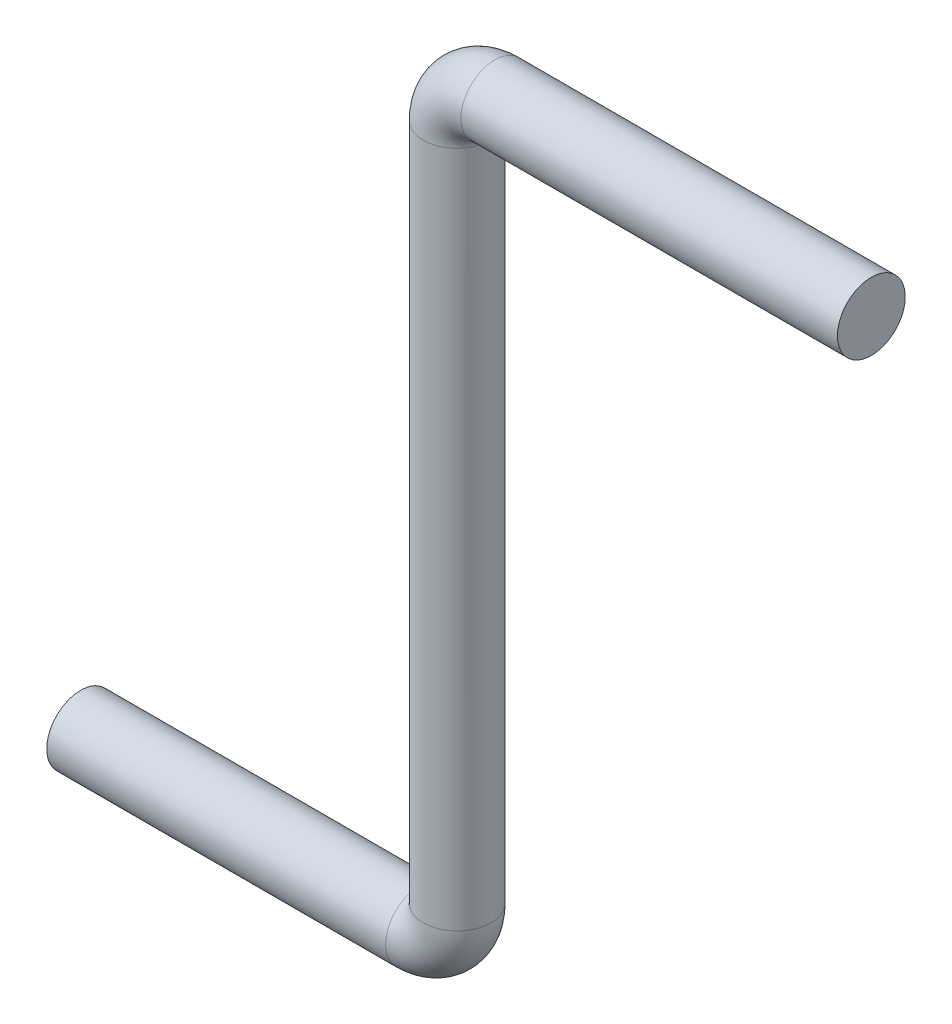
ISO-10303-21;
HEADER;
FILE_DESCRIPTION(('STEP AP214'),'2;1');
FILE_NAME('part.step','',(''),(''),'','','');
FILE_SCHEMA(('AUTOMOTIVE_DESIGN { 1 0 10303 214 1 1 1 1 }'));
ENDSEC;
DATA;
#1=APPLICATION_CONTEXT('core data for automotive mechanical design processes');
#2=APPLICATION_PROTOCOL_DEFINITION('international standard','automotive_design',2000,#1);
#3=PRODUCT_CONTEXT('',#1,'mechanical');
#4=PRODUCT('Part','Part','',(#3));
#5=PRODUCT_RELATED_PRODUCT_CATEGORY('part','',(#4));
#6=PRODUCT_DEFINITION_FORMATION('','',#4);
#7=PRODUCT_DEFINITION_CONTEXT('part definition',#1,'design');
#8=PRODUCT_DEFINITION('design','',#6,#7);
#9=PRODUCT_DEFINITION_SHAPE('','',#8);
#10=(LENGTH_UNIT() NAMED_UNIT(*) SI_UNIT(.MILLI.,.METRE.));
#11=(NAMED_UNIT(*) PLANE_ANGLE_UNIT() SI_UNIT($,.RADIAN.));
#12=(NAMED_UNIT(*) SI_UNIT($,.STERADIAN.) SOLID_ANGLE_UNIT());
#13=UNCERTAINTY_MEASURE_WITH_UNIT(LENGTH_MEASURE(1.E-05),#10,'distance_accuracy_value','');
#14=(GEOMETRIC_REPRESENTATION_CONTEXT(3) GLOBAL_UNCERTAINTY_ASSIGNED_CONTEXT((#13)) GLOBAL_UNIT_ASSIGNED_CONTEXT((#10,
#11,#12)) REPRESENTATION_CONTEXT('',''));
#15=CARTESIAN_POINT('',(0.,0.,0.));
#16=DIRECTION('',(0.,0.,1.));
#17=DIRECTION('',(1.,0.,0.));
#18=AXIS2_PLACEMENT_3D('',#15,#16,#17);
#19=CARTESIAN_POINT('',(-5.,-5.,0.));
#20=DIRECTION('',(-1.,0.,0.));
#21=DIRECTION('',(0.,-1.,0.));
#22=AXIS2_PLACEMENT_3D('',#19,#20,#21);
#23=PLANE('',#22);
#24=CARTESIAN_POINT('',(-5.,-5.,0.));
#25=DIRECTION('',(-1.,0.,0.));
#26=DIRECTION('',(0.,-1.,0.));
#27=AXIS2_PLACEMENT_3D('',#24,#25,#26);
#28=CIRCLE('',#27,0.45);
#29=CARTESIAN_POINT('',(-5.,-5.45,0.));
#30=VERTEX_POINT('',#29);
#31=EDGE_CURVE('E68',#30,#30,#28,.T.);
#32=ORIENTED_EDGE('',*,*,#31,.T.);
#33=EDGE_LOOP('',(#32));
#34=FACE_BOUND('',#33,.T.);
#35=ADVANCED_FACE('F46',(#34),#23,.T.);
#36=CARTESIAN_POINT('',(5.5,5.,0.));
#37=DIRECTION('',(-1.,0.,0.));
#38=DIRECTION('',(0.,-1.,0.));
#39=AXIS2_PLACEMENT_3D('',#36,#37,#38);
#40=PLANE('',#39);
#41=CARTESIAN_POINT('',(5.5,5.,0.));
#42=DIRECTION('',(-1.,0.,0.));
#43=DIRECTION('',(0.,-1.,0.));
#44=AXIS2_PLACEMENT_3D('',#41,#42,#43);
#45=CIRCLE('',#44,0.45);
#46=CARTESIAN_POINT('',(5.5,4.55,0.));
#47=VERTEX_POINT('',#46);
#48=EDGE_CURVE('E11',#47,#47,#45,.T.);
#49=ORIENTED_EDGE('',*,*,#48,.F.);
#50=EDGE_LOOP('',(#49));
#51=FACE_BOUND('',#50,.T.);
#52=ADVANCED_FACE('F76',(#51),#40,.F.);
#53=CARTESIAN_POINT('',(-5.,-5.,0.));
#54=DIRECTION('',(1.,0.,0.));
#55=DIRECTION('',(0.,0.,-1.));
#56=AXIS2_PLACEMENT_3D('',#53,#54,#55);
#57=CYLINDRICAL_SURFACE('',#56,0.45);
#58=CARTESIAN_POINT('',(-0.5,-5.,0.));
#59=DIRECTION('',(-1.,0.,0.));
#60=DIRECTION('',(0.,-1.,0.));
#61=AXIS2_PLACEMENT_3D('',#58,#59,#60);
#62=CIRCLE('',#61,0.45);
#63=CARTESIAN_POINT('',(-0.500000000000002,-5.45,0.));
#64=VERTEX_POINT('',#63);
#65=EDGE_CURVE('E65',#64,#64,#62,.T.);
#66=ORIENTED_EDGE('',*,*,#65,.T.);
#67=EDGE_LOOP('',(#66));
#68=FACE_BOUND('',#67,.T.);
#69=ORIENTED_EDGE('',*,*,#31,.F.);
#70=EDGE_LOOP('',(#69));
#71=FACE_BOUND('',#70,.T.);
#72=ADVANCED_FACE('F73',(#68,#71),#57,.T.);
#73=CARTESIAN_POINT('',(-0.499999999999999,-4.5,0.));
#74=DIRECTION('',(0.,0.,1.));
#75=DIRECTION('',(1.,0.,0.));
#76=AXIS2_PLACEMENT_3D('',#73,#74,#75);
#77=TOROIDAL_SURFACE('',#76,0.499999999999996,0.45);
#78=CARTESIAN_POINT('',(0.,-4.5,0.));
#79=DIRECTION('',(0.,-1.,0.));
#80=DIRECTION('',(1.,0.,0.));
#81=AXIS2_PLACEMENT_3D('',#78,#79,#80);
#82=CIRCLE('',#81,0.45);
#83=CARTESIAN_POINT('',(0.449999999999998,-4.5,0.));
#84=VERTEX_POINT('',#83);
#85=EDGE_CURVE('E60',#84,#84,#82,.T.);
#86=CARTESIAN_POINT('',(-0.499999999999999,-4.5,0.));
#87=DIRECTION('',(0.,0.,1.));
#88=DIRECTION('',(1.,0.,0.));
#89=AXIS2_PLACEMENT_3D('',#86,#87,#88);
#90=CIRCLE('',#89,0.949999999999996);
#91=EDGE_CURVE('',#64,#84,#90,.T.);
#92=ORIENTED_EDGE('',*,*,#65,.F.);
#93=ORIENTED_EDGE('',*,*,#85,.T.);
#94=ORIENTED_EDGE('',*,*,#91,.T.);
#95=ORIENTED_EDGE('',*,*,#91,.F.);
#96=EDGE_LOOP('',(#92,#94,#93,#95));
#97=FACE_BOUND('',#96,.T.);
#98=ADVANCED_FACE('F75',(#97),#77,.T.);
#99=CARTESIAN_POINT('',(0.,-4.5,0.));
#100=DIRECTION('',(0.,1.,0.));
#101=DIRECTION('',(-1.,0.,0.));
#102=AXIS2_PLACEMENT_3D('',#99,#100,#101);
#103=CYLINDRICAL_SURFACE('',#102,0.45);
#104=CARTESIAN_POINT('',(0.,4.5,0.));
#105=DIRECTION('',(0.,-1.,0.));
#106=DIRECTION('',(1.,0.,0.));
#107=AXIS2_PLACEMENT_3D('',#104,#105,#106);
#108=CIRCLE('',#107,0.45);
#109=CARTESIAN_POINT('',(-0.45,4.5,0.));
#110=VERTEX_POINT('',#109);
#111=EDGE_CURVE('E56',#110,#110,#108,.T.);
#112=ORIENTED_EDGE('',*,*,#111,.T.);
#113=EDGE_LOOP('',(#112));
#114=FACE_BOUND('',#113,.T.);
#115=ORIENTED_EDGE('',*,*,#85,.F.);
#116=EDGE_LOOP('',(#115));
#117=FACE_BOUND('',#116,.T.);
#118=ADVANCED_FACE('F83',(#114,#117),#103,.T.);
#119=CARTESIAN_POINT('',(0.499999999999999,4.5,0.));
#120=DIRECTION('',(0.,0.,-1.));
#121=DIRECTION('',(-1.,0.,0.));
#122=AXIS2_PLACEMENT_3D('',#119,#120,#121);
#123=TOROIDAL_SURFACE('',#122,0.499999999999999,0.45);
#124=CARTESIAN_POINT('',(0.499999999999997,5.,0.));
#125=DIRECTION('',(-1.,0.,0.));
#126=DIRECTION('',(0.,-1.,0.));
#127=AXIS2_PLACEMENT_3D('',#124,#125,#126);
#128=CIRCLE('',#127,0.45);
#129=CARTESIAN_POINT('',(0.499999999999996,5.45,0.));
#130=VERTEX_POINT('',#129);
#131=EDGE_CURVE('E52',#130,#130,#128,.T.);
#132=CARTESIAN_POINT('',(0.499999999999999,4.5,0.));
#133=DIRECTION('',(0.,0.,-1.));
#134=DIRECTION('',(-1.,0.,0.));
#135=AXIS2_PLACEMENT_3D('',#132,#133,#134);
#136=CIRCLE('',#135,0.949999999999999);
#137=EDGE_CURVE('',#110,#130,#136,.T.);
#138=ORIENTED_EDGE('',*,*,#111,.F.);
#139=ORIENTED_EDGE('',*,*,#131,.T.);
#140=ORIENTED_EDGE('',*,*,#137,.T.);
#141=ORIENTED_EDGE('',*,*,#137,.F.);
#142=EDGE_LOOP('',(#138,#140,#139,#141));
#143=FACE_BOUND('',#142,.T.);
#144=ADVANCED_FACE('F89',(#143),#123,.T.);
#145=CARTESIAN_POINT('',(0.499999999999999,5.,0.));
#146=DIRECTION('',(1.,0.,0.));
#147=DIRECTION('',(0.,1.,0.));
#148=AXIS2_PLACEMENT_3D('',#145,#146,#147);
#149=CYLINDRICAL_SURFACE('',#148,0.45);
#150=ORIENTED_EDGE('',*,*,#48,.T.);
#151=EDGE_LOOP('',(#150));
#152=FACE_BOUND('',#151,.T.);
#153=ORIENTED_EDGE('',*,*,#131,.F.);
#154=EDGE_LOOP('',(#153));
#155=FACE_BOUND('',#154,.T.);
#156=ADVANCED_FACE('F87',(#152,#155),#149,.T.);
#157=CLOSED_SHELL('',(#35,#52,#72,#98,#118,#144,#156));
#158=MANIFOLD_SOLID_BREP('B2',#157);
#159=ADVANCED_BREP_SHAPE_REPRESENTATION('',(#18,#158),#14);
#160=SHAPE_DEFINITION_REPRESENTATION(#9,#159);
ENDSEC;
END-ISO-10303-21;
